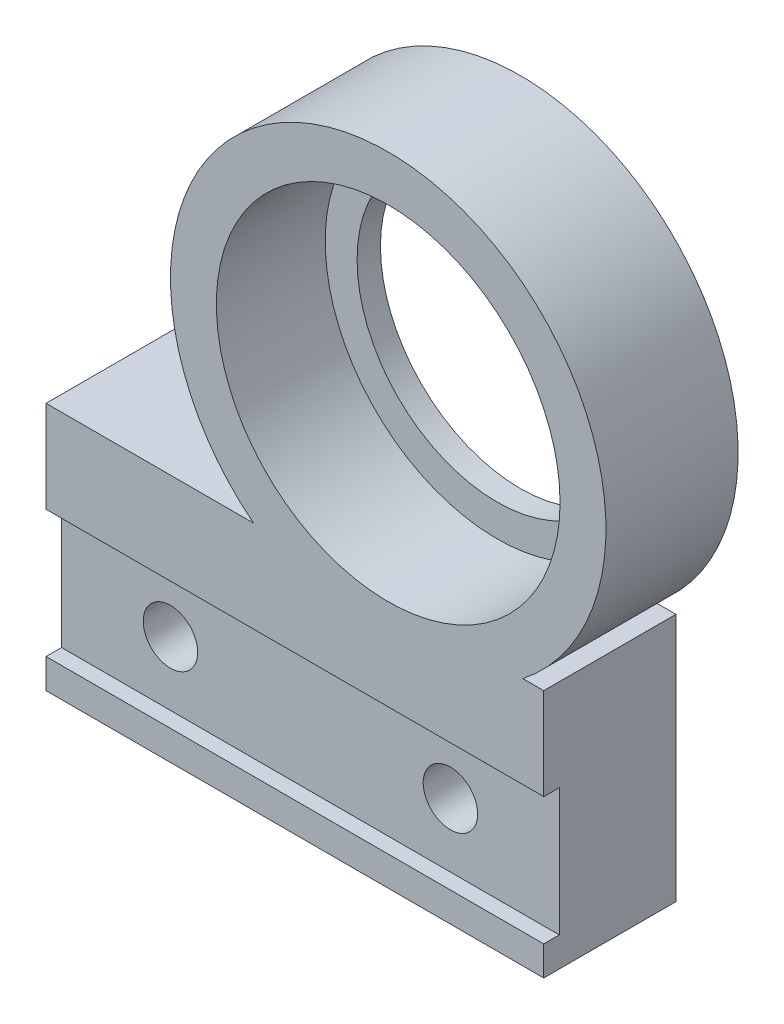
ISO-10303-21;
HEADER;
FILE_DESCRIPTION(('STEP AP214'),'2;1');
FILE_NAME('part.step','',(''),(''),'','','');
FILE_SCHEMA(('AUTOMOTIVE_DESIGN { 1 0 10303 214 1 1 1 1 }'));
ENDSEC;
DATA;
#1=APPLICATION_CONTEXT('core data for automotive mechanical design processes');
#2=APPLICATION_PROTOCOL_DEFINITION('international standard','automotive_design',2000,#1);
#3=PRODUCT_CONTEXT('',#1,'mechanical');
#4=PRODUCT('Part','Part','',(#3));
#5=PRODUCT_RELATED_PRODUCT_CATEGORY('part','',(#4));
#6=PRODUCT_DEFINITION_FORMATION('','',#4);
#7=PRODUCT_DEFINITION_CONTEXT('part definition',#1,'design');
#8=PRODUCT_DEFINITION('design','',#6,#7);
#9=PRODUCT_DEFINITION_SHAPE('','',#8);
#10=(LENGTH_UNIT() NAMED_UNIT(*) SI_UNIT(.MILLI.,.METRE.));
#11=(NAMED_UNIT(*) PLANE_ANGLE_UNIT() SI_UNIT($,.RADIAN.));
#12=(NAMED_UNIT(*) SI_UNIT($,.STERADIAN.) SOLID_ANGLE_UNIT());
#13=UNCERTAINTY_MEASURE_WITH_UNIT(LENGTH_MEASURE(1.E-05),#10,'distance_accuracy_value','');
#14=(GEOMETRIC_REPRESENTATION_CONTEXT(3) GLOBAL_UNCERTAINTY_ASSIGNED_CONTEXT((#13)) GLOBAL_UNIT_ASSIGNED_CONTEXT((#10,
#11,#12)) REPRESENTATION_CONTEXT('',''));
#15=CARTESIAN_POINT('',(0.,0.,0.));
#16=DIRECTION('',(0.,0.,1.));
#17=DIRECTION('',(1.,0.,0.));
#18=AXIS2_PLACEMENT_3D('',#15,#16,#17);
#19=CARTESIAN_POINT('',(250.,0.,-10.8));
#20=DIRECTION('',(0.,0.,1.));
#21=DIRECTION('',(1.,0.,0.));
#22=AXIS2_PLACEMENT_3D('',#19,#20,#21);
#23=PLANE('',#22);
#24=CARTESIAN_POINT('',(250.,0.,-10.8));
#25=DIRECTION('',(0.,0.,1.));
#26=DIRECTION('',(1.,0.,0.));
#27=AXIS2_PLACEMENT_3D('',#24,#25,#26);
#28=CIRCLE('',#27,9.);
#29=CARTESIAN_POINT('',(259.,0.,-10.8));
#30=VERTEX_POINT('',#29);
#31=EDGE_CURVE('E45',#30,#30,#28,.T.);
#32=ORIENTED_EDGE('',*,*,#31,.F.);
#33=EDGE_LOOP('',(#32));
#34=FACE_BOUND('',#33,.T.);
#35=CARTESIAN_POINT('',(250.,0.,-10.8));
#36=DIRECTION('',(0.,0.,1.));
#37=DIRECTION('',(1.,0.,0.));
#38=AXIS2_PLACEMENT_3D('',#35,#36,#37);
#39=CIRCLE('',#38,11.05);
#40=CARTESIAN_POINT('',(261.05,0.,-10.8));
#41=VERTEX_POINT('',#40);
#42=EDGE_CURVE('E36',#41,#41,#39,.T.);
#43=ORIENTED_EDGE('',*,*,#42,.T.);
#44=EDGE_LOOP('',(#43));
#45=FACE_BOUND('',#44,.T.);
#46=ADVANCED_FACE('F17',(#34,#45),#23,.T.);
#47=CARTESIAN_POINT('',(227.9,-25.1,-4.8));
#48=DIRECTION('',(0.,0.,1.));
#49=DIRECTION('',(1.,0.,0.));
#50=AXIS2_PLACEMENT_3D('',#47,#48,#49);
#51=PLANE('',#50);
#52=CARTESIAN_POINT('',(253.,-21.,-4.8));
#53=DIRECTION('',(0.,0.,1.));
#54=DIRECTION('',(1.,0.,0.));
#55=AXIS2_PLACEMENT_3D('',#52,#53,#54);
#56=CIRCLE('',#55,1.75);
#57=CARTESIAN_POINT('',(254.75,-21.,-4.8));
#58=VERTEX_POINT('',#57);
#59=EDGE_CURVE('E232',#58,#58,#56,.T.);
#60=ORIENTED_EDGE('',*,*,#59,.F.);
#61=EDGE_LOOP('',(#60));
#62=FACE_BOUND('',#61,.T.);
#63=CARTESIAN_POINT('',(235.,-21.,-4.8));
#64=DIRECTION('',(0.,0.,1.));
#65=DIRECTION('',(1.,0.,0.));
#66=AXIS2_PLACEMENT_3D('',#63,#64,#65);
#67=CIRCLE('',#66,1.75);
#68=CARTESIAN_POINT('',(236.75,-21.,-4.8));
#69=VERTEX_POINT('',#68);
#70=EDGE_CURVE('E227',#69,#69,#67,.T.);
#71=ORIENTED_EDGE('',*,*,#70,.F.);
#72=EDGE_LOOP('',(#71));
#73=FACE_BOUND('',#72,.T.);
#74=DIRECTION('',(1.,0.,0.));
#75=VECTOR('',#74,1.);
#76=CARTESIAN_POINT('',(227.9,-16.9,-4.8));
#77=LINE('',#76,#75);
#78=CARTESIAN_POINT('',(228.,-16.9,-4.8));
#79=VERTEX_POINT('',#78);
#80=CARTESIAN_POINT('',(260.,-16.9,-4.8));
#81=VERTEX_POINT('',#80);
#82=EDGE_CURVE('E240',#79,#81,#77,.T.);
#83=ORIENTED_EDGE('',*,*,#82,.F.);
#84=DIRECTION('',(0.,-1.,0.));
#85=VECTOR('',#84,1.);
#86=CARTESIAN_POINT('',(228.,-26.05,-4.8));
#87=LINE('',#86,#85);
#88=CARTESIAN_POINT('',(228.,-25.1,-4.8));
#89=VERTEX_POINT('',#88);
#90=EDGE_CURVE('E214',#79,#89,#87,.T.);
#91=ORIENTED_EDGE('',*,*,#90,.T.);
#92=DIRECTION('',(1.,0.,0.));
#93=VECTOR('',#92,1.);
#94=CARTESIAN_POINT('',(227.9,-25.1,-4.8));
#95=LINE('',#94,#93);
#96=CARTESIAN_POINT('',(260.,-25.1,-4.8));
#97=VERTEX_POINT('',#96);
#98=EDGE_CURVE('E11',#89,#97,#95,.T.);
#99=ORIENTED_EDGE('',*,*,#98,.T.);
#100=DIRECTION('',(0.,-1.,0.));
#101=VECTOR('',#100,1.);
#102=CARTESIAN_POINT('',(260.,-26.05,-4.8));
#103=LINE('',#102,#101);
#104=EDGE_CURVE('E202',#81,#97,#103,.T.);
#105=ORIENTED_EDGE('',*,*,#104,.F.);
#106=EDGE_LOOP('',(#83,#91,#99,#105));
#107=FACE_BOUND('',#106,.T.);
#108=ADVANCED_FACE('F263',(#62,#73,#107),#51,.T.);
#109=CARTESIAN_POINT('',(227.9,-25.1,-4.8));
#110=DIRECTION('',(0.,1.,0.));
#111=DIRECTION('',(1.,0.,0.));
#112=AXIS2_PLACEMENT_3D('',#109,#110,#111);
#113=PLANE('',#112);
#114=ORIENTED_EDGE('',*,*,#98,.F.);
#115=DIRECTION('',(0.,0.,1.));
#116=VECTOR('',#115,1.);
#117=CARTESIAN_POINT('',(228.,-25.1,-8.55));
#118=LINE('',#117,#116);
#119=CARTESIAN_POINT('',(228.,-25.1,-3.8));
#120=VERTEX_POINT('',#119);
#121=EDGE_CURVE('E210',#89,#120,#118,.T.);
#122=ORIENTED_EDGE('',*,*,#121,.T.);
#123=DIRECTION('',(-1.,0.,0.));
#124=VECTOR('',#123,1.);
#125=CARTESIAN_POINT('',(238.95,-25.1,-3.8));
#126=LINE('',#125,#124);
#127=CARTESIAN_POINT('',(260.,-25.1,-3.8));
#128=VERTEX_POINT('',#127);
#129=EDGE_CURVE('E26',#128,#120,#126,.T.);
#130=ORIENTED_EDGE('',*,*,#129,.F.);
#131=DIRECTION('',(0.,0.,1.));
#132=VECTOR('',#131,1.);
#133=CARTESIAN_POINT('',(260.,-25.1,-8.55));
#134=LINE('',#133,#132);
#135=EDGE_CURVE('E206',#97,#128,#134,.T.);
#136=ORIENTED_EDGE('',*,*,#135,.F.);
#137=EDGE_LOOP('',(#114,#122,#130,#136));
#138=FACE_BOUND('',#137,.T.);
#139=ADVANCED_FACE('F260',(#138),#113,.T.);
#140=CARTESIAN_POINT('',(250.,0.,-3.8));
#141=DIRECTION('',(0.,0.,1.));
#142=DIRECTION('',(1.,0.,0.));
#143=AXIS2_PLACEMENT_3D('',#140,#141,#142);
#144=PLANE('',#143);
#145=ORIENTED_EDGE('',*,*,#129,.T.);
#146=DIRECTION('',(0.,1.,0.));
#147=VECTOR('',#146,1.);
#148=CARTESIAN_POINT('',(228.,-27.,-3.8));
#149=LINE('',#148,#147);
#150=CARTESIAN_POINT('',(228.,-27.,-3.8));
#151=VERTEX_POINT('',#150);
#152=EDGE_CURVE('E222',#151,#120,#149,.T.);
#153=ORIENTED_EDGE('',*,*,#152,.F.);
#154=DIRECTION('',(1.,0.,0.));
#155=VECTOR('',#154,1.);
#156=CARTESIAN_POINT('',(228.,-27.,-3.8));
#157=LINE('',#156,#155);
#158=CARTESIAN_POINT('',(260.,-27.,-3.8));
#159=VERTEX_POINT('',#158);
#160=EDGE_CURVE('E226',#151,#159,#157,.T.);
#161=ORIENTED_EDGE('',*,*,#160,.T.);
#162=DIRECTION('',(0.,1.,0.));
#163=VECTOR('',#162,1.);
#164=CARTESIAN_POINT('',(260.,-27.,-3.8));
#165=LINE('',#164,#163);
#166=EDGE_CURVE('E164',#159,#128,#165,.T.);
#167=ORIENTED_EDGE('',*,*,#166,.T.);
#168=EDGE_LOOP('',(#145,#153,#161,#167));
#169=FACE_BOUND('',#168,.T.);
#170=ADVANCED_FACE('F251',(#169),#144,.T.);
#171=CARTESIAN_POINT('',(250.,0.,-10.8));
#172=DIRECTION('',(0.,0.,1.));
#173=DIRECTION('',(1.,0.,0.));
#174=AXIS2_PLACEMENT_3D('',#171,#172,#173);
#175=CYLINDRICAL_SURFACE('',#174,11.05);
#176=DIRECTION('',(0.,0.,1.));
#177=VECTOR('',#176,1.);
#178=CARTESIAN_POINT('',(261.05,0.,-10.8));
#179=LINE('',#178,#177);
#180=CARTESIAN_POINT('',(261.05,0.,-3.8));
#181=VERTEX_POINT('',#180);
#182=EDGE_CURVE('E243',#41,#181,#179,.T.);
#183=ORIENTED_EDGE('',*,*,#182,.F.);
#184=ORIENTED_EDGE('',*,*,#42,.F.);
#185=ORIENTED_EDGE('',*,*,#182,.T.);
#186=CARTESIAN_POINT('',(250.,0.,-3.8));
#187=DIRECTION('',(0.,0.,1.));
#188=DIRECTION('',(1.,0.,0.));
#189=AXIS2_PLACEMENT_3D('',#186,#187,#188);
#190=CIRCLE('',#189,11.05);
#191=EDGE_CURVE('E165',#181,#181,#190,.T.);
#192=ORIENTED_EDGE('',*,*,#191,.T.);
#193=EDGE_LOOP('',(#183,#184,#185,#192));
#194=FACE_BOUND('',#193,.T.);
#195=ADVANCED_FACE('F19',(#194),#175,.F.);
#196=CARTESIAN_POINT('',(227.9,-16.9,-4.8));
#197=DIRECTION('',(0.,1.,0.));
#198=DIRECTION('',(1.,0.,0.));
#199=AXIS2_PLACEMENT_3D('',#196,#197,#198);
#200=PLANE('',#199);
#201=DIRECTION('',(0.,0.,1.));
#202=VECTOR('',#201,1.);
#203=CARTESIAN_POINT('',(260.,-16.9,-8.55));
#204=LINE('',#203,#202);
#205=CARTESIAN_POINT('',(260.,-16.9,-3.8));
#206=VERTEX_POINT('',#205);
#207=EDGE_CURVE('E201',#81,#206,#204,.T.);
#208=ORIENTED_EDGE('',*,*,#207,.T.);
#209=DIRECTION('',(-1.,0.,0.));
#210=VECTOR('',#209,1.);
#211=CARTESIAN_POINT('',(238.95,-16.9,-3.8));
#212=LINE('',#211,#210);
#213=CARTESIAN_POINT('',(228.,-16.9,-3.8));
#214=VERTEX_POINT('',#213);
#215=EDGE_CURVE('E180',#206,#214,#212,.T.);
#216=ORIENTED_EDGE('',*,*,#215,.T.);
#217=DIRECTION('',(0.,0.,1.));
#218=VECTOR('',#217,1.);
#219=CARTESIAN_POINT('',(228.,-16.9,-8.55));
#220=LINE('',#219,#218);
#221=EDGE_CURVE('E218',#79,#214,#220,.T.);
#222=ORIENTED_EDGE('',*,*,#221,.F.);
#223=ORIENTED_EDGE('',*,*,#82,.T.);
#224=EDGE_LOOP('',(#208,#216,#222,#223));
#225=FACE_BOUND('',#224,.T.);
#226=ADVANCED_FACE('F267',(#225),#200,.F.);
#227=CARTESIAN_POINT('',(250.,0.,-13.3));
#228=DIRECTION('',(0.,0.,1.));
#229=DIRECTION('',(1.,0.,0.));
#230=AXIS2_PLACEMENT_3D('',#227,#228,#229);
#231=CYLINDRICAL_SURFACE('',#230,9.);
#232=DIRECTION('',(0.,0.,1.));
#233=VECTOR('',#232,1.);
#234=CARTESIAN_POINT('',(259.,0.,-13.3));
#235=LINE('',#234,#233);
#236=CARTESIAN_POINT('',(259.,0.,-12.3));
#237=VERTEX_POINT('',#236);
#238=EDGE_CURVE('E235',#237,#30,#235,.T.);
#239=ORIENTED_EDGE('',*,*,#238,.F.);
#240=CARTESIAN_POINT('',(250.,0.,-12.3));
#241=DIRECTION('',(0.,0.,1.));
#242=DIRECTION('',(1.,0.,0.));
#243=AXIS2_PLACEMENT_3D('',#240,#241,#242);
#244=CIRCLE('',#243,9.);
#245=EDGE_CURVE('E278',#237,#237,#244,.T.);
#246=ORIENTED_EDGE('',*,*,#245,.F.);
#247=ORIENTED_EDGE('',*,*,#238,.T.);
#248=ORIENTED_EDGE('',*,*,#31,.T.);
#249=EDGE_LOOP('',(#239,#246,#247,#248));
#250=FACE_BOUND('',#249,.T.);
#251=ADVANCED_FACE('F362',(#250),#231,.F.);
#252=CARTESIAN_POINT('',(253.,-21.,-13.3));
#253=DIRECTION('',(0.,0.,1.));
#254=DIRECTION('',(1.,0.,0.));
#255=AXIS2_PLACEMENT_3D('',#252,#253,#254);
#256=CYLINDRICAL_SURFACE('',#255,1.75);
#257=DIRECTION('',(0.,0.,1.));
#258=VECTOR('',#257,1.);
#259=CARTESIAN_POINT('',(254.75,-21.,-13.3));
#260=LINE('',#259,#258);
#261=CARTESIAN_POINT('',(254.75,-21.,-12.3));
#262=VERTEX_POINT('',#261);
#263=EDGE_CURVE('E230',#262,#58,#260,.T.);
#264=ORIENTED_EDGE('',*,*,#263,.F.);
#265=CARTESIAN_POINT('',(253.,-21.,-12.3));
#266=DIRECTION('',(0.,0.,1.));
#267=DIRECTION('',(1.,0.,0.));
#268=AXIS2_PLACEMENT_3D('',#265,#266,#267);
#269=CIRCLE('',#268,1.75);
#270=EDGE_CURVE('E282',#262,#262,#269,.T.);
#271=ORIENTED_EDGE('',*,*,#270,.F.);
#272=ORIENTED_EDGE('',*,*,#263,.T.);
#273=ORIENTED_EDGE('',*,*,#59,.T.);
#274=EDGE_LOOP('',(#264,#271,#272,#273));
#275=FACE_BOUND('',#274,.T.);
#276=ADVANCED_FACE('F365',(#275),#256,.F.);
#277=CARTESIAN_POINT('',(235.,-21.,-13.3));
#278=DIRECTION('',(0.,0.,1.));
#279=DIRECTION('',(1.,0.,0.));
#280=AXIS2_PLACEMENT_3D('',#277,#278,#279);
#281=CYLINDRICAL_SURFACE('',#280,1.75);
#282=DIRECTION('',(0.,0.,1.));
#283=VECTOR('',#282,1.);
#284=CARTESIAN_POINT('',(236.75,-21.,-13.3));
#285=LINE('',#284,#283);
#286=CARTESIAN_POINT('',(236.75,-21.,-12.3));
#287=VERTEX_POINT('',#286);
#288=EDGE_CURVE('E231',#287,#69,#285,.T.);
#289=ORIENTED_EDGE('',*,*,#288,.F.);
#290=CARTESIAN_POINT('',(235.,-21.,-12.3));
#291=DIRECTION('',(0.,0.,1.));
#292=DIRECTION('',(1.,0.,0.));
#293=AXIS2_PLACEMENT_3D('',#290,#291,#292);
#294=CIRCLE('',#293,1.75);
#295=EDGE_CURVE('E287',#287,#287,#294,.T.);
#296=ORIENTED_EDGE('',*,*,#295,.F.);
#297=ORIENTED_EDGE('',*,*,#288,.T.);
#298=ORIENTED_EDGE('',*,*,#70,.T.);
#299=EDGE_LOOP('',(#289,#296,#297,#298));
#300=FACE_BOUND('',#299,.T.);
#301=ADVANCED_FACE('F368',(#300),#281,.F.);
#302=CARTESIAN_POINT('',(228.,-27.,-12.3));
#303=DIRECTION('',(0.,1.,0.));
#304=DIRECTION('',(1.,0.,0.));
#305=AXIS2_PLACEMENT_3D('',#302,#303,#304);
#306=PLANE('',#305);
#307=DIRECTION('',(0.,0.,1.));
#308=VECTOR('',#307,1.);
#309=CARTESIAN_POINT('',(260.,-27.,-12.3));
#310=LINE('',#309,#308);
#311=CARTESIAN_POINT('',(260.,-27.,-12.3));
#312=VERTEX_POINT('',#311);
#313=EDGE_CURVE('E197',#312,#159,#310,.T.);
#314=ORIENTED_EDGE('',*,*,#313,.T.);
#315=ORIENTED_EDGE('',*,*,#160,.F.);
#316=DIRECTION('',(0.,0.,1.));
#317=VECTOR('',#316,1.);
#318=CARTESIAN_POINT('',(228.,-27.,-12.3));
#319=LINE('',#318,#317);
#320=CARTESIAN_POINT('',(228.,-27.,-12.3));
#321=VERTEX_POINT('',#320);
#322=EDGE_CURVE('E221',#321,#151,#319,.T.);
#323=ORIENTED_EDGE('',*,*,#322,.F.);
#324=DIRECTION('',(1.,0.,0.));
#325=VECTOR('',#324,1.);
#326=CARTESIAN_POINT('',(228.,-27.,-12.3));
#327=LINE('',#326,#325);
#328=EDGE_CURVE('E292',#321,#312,#327,.T.);
#329=ORIENTED_EDGE('',*,*,#328,.T.);
#330=EDGE_LOOP('',(#314,#315,#323,#329));
#331=FACE_BOUND('',#330,.T.);
#332=ADVANCED_FACE('F371',(#331),#306,.F.);
#333=CARTESIAN_POINT('',(228.,-27.,-12.3));
#334=DIRECTION('',(1.,0.,0.));
#335=DIRECTION('',(0.,1.,0.));
#336=AXIS2_PLACEMENT_3D('',#333,#334,#335);
#337=PLANE('',#336);
#338=ORIENTED_EDGE('',*,*,#121,.F.);
#339=ORIENTED_EDGE('',*,*,#90,.F.);
#340=ORIENTED_EDGE('',*,*,#221,.T.);
#341=DIRECTION('',(0.,1.,0.));
#342=VECTOR('',#341,1.);
#343=CARTESIAN_POINT('',(228.,-27.,-3.8));
#344=LINE('',#343,#342);
#345=CARTESIAN_POINT('',(228.,-11.,-3.8));
#346=VERTEX_POINT('',#345);
#347=EDGE_CURVE('E186',#214,#346,#344,.T.);
#348=ORIENTED_EDGE('',*,*,#347,.T.);
#349=DIRECTION('',(0.,0.,1.));
#350=VECTOR('',#349,1.);
#351=CARTESIAN_POINT('',(228.,-11.,-12.3));
#352=LINE('',#351,#350);
#353=CARTESIAN_POINT('',(228.,-11.,-12.3));
#354=VERTEX_POINT('',#353);
#355=EDGE_CURVE('E272',#354,#346,#352,.T.);
#356=ORIENTED_EDGE('',*,*,#355,.F.);
#357=DIRECTION('',(0.,1.,0.));
#358=VECTOR('',#357,1.);
#359=CARTESIAN_POINT('',(228.,-27.,-12.3));
#360=LINE('',#359,#358);
#361=EDGE_CURVE('E291',#321,#354,#360,.T.);
#362=ORIENTED_EDGE('',*,*,#361,.F.);
#363=ORIENTED_EDGE('',*,*,#322,.T.);
#364=ORIENTED_EDGE('',*,*,#152,.T.);
#365=EDGE_LOOP('',(#338,#339,#340,#348,#356,#362,#363,#364));
#366=FACE_BOUND('',#365,.T.);
#367=ADVANCED_FACE('F257',(#366),#337,.F.);
#368=CARTESIAN_POINT('',(260.,-27.,-12.3));
#369=DIRECTION('',(1.,0.,0.));
#370=DIRECTION('',(0.,1.,0.));
#371=AXIS2_PLACEMENT_3D('',#368,#369,#370);
#372=PLANE('',#371);
#373=ORIENTED_EDGE('',*,*,#166,.F.);
#374=ORIENTED_EDGE('',*,*,#313,.F.);
#375=DIRECTION('',(0.,1.,0.));
#376=VECTOR('',#375,1.);
#377=CARTESIAN_POINT('',(260.,-27.,-12.3));
#378=LINE('',#377,#376);
#379=CARTESIAN_POINT('',(260.,-11.,-12.3));
#380=VERTEX_POINT('',#379);
#381=EDGE_CURVE('E160',#312,#380,#378,.T.);
#382=ORIENTED_EDGE('',*,*,#381,.T.);
#383=DIRECTION('',(0.,0.,1.));
#384=VECTOR('',#383,1.);
#385=CARTESIAN_POINT('',(260.,-11.,-12.3));
#386=LINE('',#385,#384);
#387=CARTESIAN_POINT('',(260.,-11.,-3.8));
#388=VERTEX_POINT('',#387);
#389=EDGE_CURVE('E151',#380,#388,#386,.T.);
#390=ORIENTED_EDGE('',*,*,#389,.T.);
#391=DIRECTION('',(0.,1.,0.));
#392=VECTOR('',#391,1.);
#393=CARTESIAN_POINT('',(260.,-27.,-3.8));
#394=LINE('',#393,#392);
#395=EDGE_CURVE('E157',#206,#388,#394,.T.);
#396=ORIENTED_EDGE('',*,*,#395,.F.);
#397=ORIENTED_EDGE('',*,*,#207,.F.);
#398=ORIENTED_EDGE('',*,*,#104,.T.);
#399=ORIENTED_EDGE('',*,*,#135,.T.);
#400=EDGE_LOOP('',(#373,#374,#382,#390,#396,#397,#398,#399));
#401=FACE_BOUND('',#400,.T.);
#402=ADVANCED_FACE('F154',(#401),#372,.T.);
#403=CARTESIAN_POINT('',(228.,-11.,-12.3));
#404=DIRECTION('',(0.,1.,0.));
#405=DIRECTION('',(1.,0.,0.));
#406=AXIS2_PLACEMENT_3D('',#403,#404,#405);
#407=PLANE('',#406);
#408=DIRECTION('',(1.,0.,0.));
#409=VECTOR('',#408,1.);
#410=CARTESIAN_POINT('',(228.,-11.,-12.3));
#411=LINE('',#410,#409);
#412=CARTESIAN_POINT('',(258.66025403784,-11.,-12.3));
#413=VERTEX_POINT('',#412);
#414=EDGE_CURVE('E298',#413,#380,#411,.T.);
#415=ORIENTED_EDGE('',*,*,#414,.F.);
#416=DIRECTION('',(0.,0.,1.));
#417=VECTOR('',#416,1.);
#418=CARTESIAN_POINT('',(258.66025403784,-11.,-12.3));
#419=LINE('',#418,#417);
#420=CARTESIAN_POINT('',(258.66025403784,-11.,-3.8));
#421=VERTEX_POINT('',#420);
#422=EDGE_CURVE('E171',#413,#421,#419,.T.);
#423=ORIENTED_EDGE('',*,*,#422,.T.);
#424=DIRECTION('',(1.,0.,0.));
#425=VECTOR('',#424,1.);
#426=CARTESIAN_POINT('',(228.,-11.,-3.8));
#427=LINE('',#426,#425);
#428=EDGE_CURVE('E168',#421,#388,#427,.T.);
#429=ORIENTED_EDGE('',*,*,#428,.T.);
#430=ORIENTED_EDGE('',*,*,#389,.F.);
#431=EDGE_LOOP('',(#415,#423,#429,#430));
#432=FACE_BOUND('',#431,.T.);
#433=ADVANCED_FACE('F169',(#432),#407,.T.);
#434=CARTESIAN_POINT('',(250.,0.,-3.8));
#435=DIRECTION('',(0.,0.,1.));
#436=DIRECTION('',(1.,0.,0.));
#437=AXIS2_PLACEMENT_3D('',#434,#435,#436);
#438=PLANE('',#437);
#439=ORIENTED_EDGE('',*,*,#191,.F.);
#440=EDGE_LOOP('',(#439));
#441=FACE_BOUND('',#440,.T.);
#442=CARTESIAN_POINT('',(250.,0.,-3.8));
#443=DIRECTION('',(0.,0.,-1.));
#444=DIRECTION('',(-0.61858957413204,-0.785714285714051,0.));
#445=AXIS2_PLACEMENT_3D('',#442,#443,#444);
#446=CIRCLE('',#445,14.);
#447=CARTESIAN_POINT('',(241.33974596215,-11.,-3.8));
#448=VERTEX_POINT('',#447);
#449=EDGE_CURVE('E303',#448,#421,#446,.T.);
#450=ORIENTED_EDGE('',*,*,#449,.F.);
#451=DIRECTION('',(1.,0.,0.));
#452=VECTOR('',#451,1.);
#453=CARTESIAN_POINT('',(228.,-11.,-3.8));
#454=LINE('',#453,#452);
#455=EDGE_CURVE('E268',#346,#448,#454,.T.);
#456=ORIENTED_EDGE('',*,*,#455,.F.);
#457=ORIENTED_EDGE('',*,*,#347,.F.);
#458=ORIENTED_EDGE('',*,*,#215,.F.);
#459=ORIENTED_EDGE('',*,*,#395,.T.);
#460=ORIENTED_EDGE('',*,*,#428,.F.);
#461=EDGE_LOOP('',(#450,#456,#457,#458,#459,#460));
#462=FACE_BOUND('',#461,.T.);
#463=ADVANCED_FACE('F177',(#441,#462),#438,.T.);
#464=CARTESIAN_POINT('',(228.,-11.,-12.3));
#465=DIRECTION('',(0.,1.,0.));
#466=DIRECTION('',(1.,0.,0.));
#467=AXIS2_PLACEMENT_3D('',#464,#465,#466);
#468=PLANE('',#467);
#469=DIRECTION('',(1.,0.,0.));
#470=VECTOR('',#469,1.);
#471=CARTESIAN_POINT('',(228.,-11.,-12.3));
#472=LINE('',#471,#470);
#473=CARTESIAN_POINT('',(241.33974596215,-11.,-12.3));
#474=VERTEX_POINT('',#473);
#475=EDGE_CURVE('E288',#354,#474,#472,.T.);
#476=ORIENTED_EDGE('',*,*,#475,.F.);
#477=ORIENTED_EDGE('',*,*,#355,.T.);
#478=ORIENTED_EDGE('',*,*,#455,.T.);
#479=DIRECTION('',(0.,0.,1.));
#480=VECTOR('',#479,1.);
#481=CARTESIAN_POINT('',(241.33974596215,-11.,-12.3));
#482=LINE('',#481,#480);
#483=EDGE_CURVE('E306',#474,#448,#482,.T.);
#484=ORIENTED_EDGE('',*,*,#483,.F.);
#485=EDGE_LOOP('',(#476,#477,#478,#484));
#486=FACE_BOUND('',#485,.T.);
#487=ADVANCED_FACE('F339',(#486),#468,.T.);
#488=CARTESIAN_POINT('',(250.,0.,-12.3));
#489=DIRECTION('',(0.,0.,1.));
#490=DIRECTION('',(1.,0.,0.));
#491=AXIS2_PLACEMENT_3D('',#488,#489,#490);
#492=PLANE('',#491);
#493=ORIENTED_EDGE('',*,*,#245,.T.);
#494=EDGE_LOOP('',(#493));
#495=FACE_BOUND('',#494,.T.);
#496=ORIENTED_EDGE('',*,*,#270,.T.);
#497=EDGE_LOOP('',(#496));
#498=FACE_BOUND('',#497,.T.);
#499=ORIENTED_EDGE('',*,*,#295,.T.);
#500=EDGE_LOOP('',(#499));
#501=FACE_BOUND('',#500,.T.);
#502=ORIENTED_EDGE('',*,*,#414,.T.);
#503=ORIENTED_EDGE('',*,*,#381,.F.);
#504=ORIENTED_EDGE('',*,*,#328,.F.);
#505=ORIENTED_EDGE('',*,*,#361,.T.);
#506=ORIENTED_EDGE('',*,*,#475,.T.);
#507=CARTESIAN_POINT('',(250.,0.,-12.3));
#508=DIRECTION('',(0.,0.,1.));
#509=DIRECTION('',(0.61858957413204,-0.785714285714051,0.));
#510=AXIS2_PLACEMENT_3D('',#507,#508,#509);
#511=CIRCLE('',#510,14.);
#512=EDGE_CURVE('E322',#413,#474,#511,.T.);
#513=ORIENTED_EDGE('',*,*,#512,.F.);
#514=EDGE_LOOP('',(#502,#503,#504,#505,#506,#513));
#515=FACE_BOUND('',#514,.T.);
#516=ADVANCED_FACE('F336',(#495,#498,#501,#515),#492,.F.);
#517=CARTESIAN_POINT('',(250.,0.,-12.3));
#518=DIRECTION('',(0.,0.,1.));
#519=DIRECTION('',(1.,0.,0.));
#520=AXIS2_PLACEMENT_3D('',#517,#518,#519);
#521=CYLINDRICAL_SURFACE('',#520,14.);
#522=ORIENTED_EDGE('',*,*,#512,.T.);
#523=ORIENTED_EDGE('',*,*,#483,.T.);
#524=ORIENTED_EDGE('',*,*,#449,.T.);
#525=ORIENTED_EDGE('',*,*,#422,.F.);
#526=EDGE_LOOP('',(#522,#523,#524,#525));
#527=FACE_BOUND('',#526,.T.);
#528=ADVANCED_FACE('F334',(#527),#521,.T.);
#529=CLOSED_SHELL('',(#46,#108,#139,#170,#195,#226,#251,#276,#301,#332,#367,#402,#433,#463,#487,
#516,#528));
#530=MANIFOLD_SOLID_BREP('B1',#529);
#531=ADVANCED_BREP_SHAPE_REPRESENTATION('',(#18,#530),#14);
#532=SHAPE_DEFINITION_REPRESENTATION(#9,#531);
ENDSEC;
END-ISO-10303-21;
